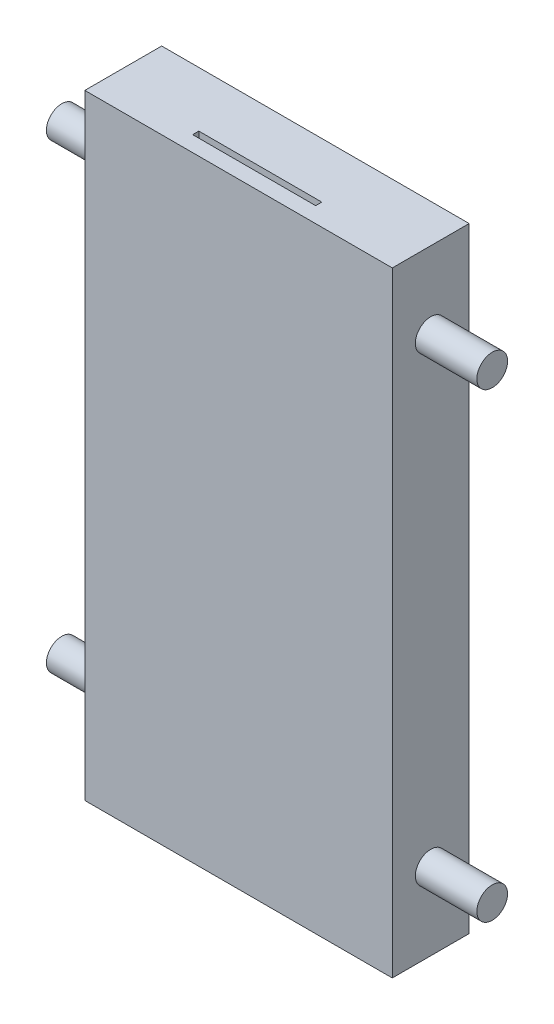
ISO-10303-21;
HEADER;
FILE_DESCRIPTION(('STEP AP214'),'2;1');
FILE_NAME('part.step','',(''),(''),'','','');
FILE_SCHEMA(('AUTOMOTIVE_DESIGN { 1 0 10303 214 1 1 1 1 }'));
ENDSEC;
DATA;
#1=APPLICATION_CONTEXT('core data for automotive mechanical design processes');
#2=APPLICATION_PROTOCOL_DEFINITION('international standard','automotive_design',2000,#1);
#3=PRODUCT_CONTEXT('',#1,'mechanical');
#4=PRODUCT('Part','Part','',(#3));
#5=PRODUCT_RELATED_PRODUCT_CATEGORY('part','',(#4));
#6=PRODUCT_DEFINITION_FORMATION('','',#4);
#7=PRODUCT_DEFINITION_CONTEXT('part definition',#1,'design');
#8=PRODUCT_DEFINITION('design','',#6,#7);
#9=PRODUCT_DEFINITION_SHAPE('','',#8);
#10=(LENGTH_UNIT() NAMED_UNIT(*) SI_UNIT(.MILLI.,.METRE.));
#11=(NAMED_UNIT(*) PLANE_ANGLE_UNIT() SI_UNIT($,.RADIAN.));
#12=(NAMED_UNIT(*) SI_UNIT($,.STERADIAN.) SOLID_ANGLE_UNIT());
#13=UNCERTAINTY_MEASURE_WITH_UNIT(LENGTH_MEASURE(1.E-05),#10,'distance_accuracy_value','');
#14=(GEOMETRIC_REPRESENTATION_CONTEXT(3) GLOBAL_UNCERTAINTY_ASSIGNED_CONTEXT((#13)) GLOBAL_UNIT_ASSIGNED_CONTEXT((#10,
#11,#12)) REPRESENTATION_CONTEXT('',''));
#15=CARTESIAN_POINT('',(0.,0.,0.));
#16=DIRECTION('',(0.,0.,1.));
#17=DIRECTION('',(1.,0.,0.));
#18=AXIS2_PLACEMENT_3D('',#15,#16,#17);
#19=CARTESIAN_POINT('',(12.7,0.,3.175));
#20=DIRECTION('',(0.,1.,0.));
#21=DIRECTION('',(0.,0.,1.));
#22=AXIS2_PLACEMENT_3D('',#19,#20,#21);
#23=PLANE('',#22);
#24=DIRECTION('',(-1.,0.,0.));
#25=VECTOR('',#24,1.);
#26=CARTESIAN_POINT('',(8.89000000000002,0.,2.27655366080337));
#27=LINE('',#26,#25);
#28=CARTESIAN_POINT('',(8.89000000000002,0.,2.27655366080337));
#29=VERTEX_POINT('',#28);
#30=CARTESIAN_POINT('',(3.81000000000002,0.,2.27655366080337));
#31=VERTEX_POINT('',#30);
#32=EDGE_CURVE('E129',#29,#31,#27,.T.);
#33=ORIENTED_EDGE('',*,*,#32,.T.);
#34=DIRECTION('',(0.,0.,1.));
#35=VECTOR('',#34,1.);
#36=CARTESIAN_POINT('',(3.81000000000002,0.,2.53055366080337));
#37=LINE('',#36,#35);
#38=CARTESIAN_POINT('',(3.81000000000002,0.,2.53055366080337));
#39=VERTEX_POINT('',#38);
#40=EDGE_CURVE('E122',#31,#39,#37,.T.);
#41=ORIENTED_EDGE('',*,*,#40,.T.);
#42=DIRECTION('',(1.,0.,0.));
#43=VECTOR('',#42,1.);
#44=CARTESIAN_POINT('',(8.89000000000002,0.,2.53055366080337));
#45=LINE('',#44,#43);
#46=CARTESIAN_POINT('',(8.89000000000002,0.,2.53055366080337));
#47=VERTEX_POINT('',#46);
#48=EDGE_CURVE('E132',#39,#47,#45,.T.);
#49=ORIENTED_EDGE('',*,*,#48,.T.);
#50=DIRECTION('',(0.,0.,-1.));
#51=VECTOR('',#50,1.);
#52=CARTESIAN_POINT('',(8.89000000000002,0.,2.53055366080337));
#53=LINE('',#52,#51);
#54=EDGE_CURVE('E58',#47,#29,#53,.T.);
#55=ORIENTED_EDGE('',*,*,#54,.T.);
#56=EDGE_LOOP('',(#33,#41,#49,#55));
#57=FACE_BOUND('',#56,.T.);
#58=DIRECTION('',(1.,0.,0.));
#59=VECTOR('',#58,1.);
#60=CARTESIAN_POINT('',(12.7,0.,0.));
#61=LINE('',#60,#59);
#62=CARTESIAN_POINT('',(0.,0.,0.));
#63=VERTEX_POINT('',#62);
#64=CARTESIAN_POINT('',(12.7,0.,0.));
#65=VERTEX_POINT('',#64);
#66=EDGE_CURVE('E191',#63,#65,#61,.T.);
#67=ORIENTED_EDGE('',*,*,#66,.T.);
#68=DIRECTION('',(0.,0.,-1.));
#69=VECTOR('',#68,1.);
#70=CARTESIAN_POINT('',(12.7,0.,3.175));
#71=LINE('',#70,#69);
#72=CARTESIAN_POINT('',(12.7,0.,3.175));
#73=VERTEX_POINT('',#72);
#74=EDGE_CURVE('E11',#73,#65,#71,.T.);
#75=ORIENTED_EDGE('',*,*,#74,.F.);
#76=DIRECTION('',(1.,0.,0.));
#77=VECTOR('',#76,1.);
#78=CARTESIAN_POINT('',(12.7,0.,3.175));
#79=LINE('',#78,#77);
#80=CARTESIAN_POINT('',(0.,0.,3.175));
#81=VERTEX_POINT('',#80);
#82=EDGE_CURVE('E192',#81,#73,#79,.T.);
#83=ORIENTED_EDGE('',*,*,#82,.F.);
#84=DIRECTION('',(0.,0.,-1.));
#85=VECTOR('',#84,1.);
#86=CARTESIAN_POINT('',(0.,0.,3.175));
#87=LINE('',#86,#85);
#88=EDGE_CURVE('E206',#81,#63,#87,.T.);
#89=ORIENTED_EDGE('',*,*,#88,.T.);
#90=EDGE_LOOP('',(#67,#75,#83,#89));
#91=FACE_BOUND('',#90,.T.);
#92=ADVANCED_FACE('F38',(#57,#91),#23,.F.);
#93=CARTESIAN_POINT('',(12.7,25.4,3.175));
#94=DIRECTION('',(-1.,0.,0.));
#95=DIRECTION('',(0.,0.,1.));
#96=AXIS2_PLACEMENT_3D('',#93,#94,#95);
#97=PLANE('',#96);
#98=CARTESIAN_POINT('',(12.7,3.175,1.5875));
#99=DIRECTION('',(-1.,0.,0.));
#100=DIRECTION('',(0.,0.,1.));
#101=AXIS2_PLACEMENT_3D('',#98,#99,#100);
#102=CIRCLE('',#101,0.635);
#103=CARTESIAN_POINT('',(12.7,3.175,2.2225));
#104=VERTEX_POINT('',#103);
#105=EDGE_CURVE('E175',#104,#104,#102,.T.);
#106=ORIENTED_EDGE('',*,*,#105,.T.);
#107=EDGE_LOOP('',(#106));
#108=FACE_BOUND('',#107,.T.);
#109=CARTESIAN_POINT('',(12.7,22.225,1.5875));
#110=DIRECTION('',(-1.,0.,0.));
#111=DIRECTION('',(0.,0.,1.));
#112=AXIS2_PLACEMENT_3D('',#109,#110,#111);
#113=CIRCLE('',#112,0.635);
#114=CARTESIAN_POINT('',(12.7,22.225,2.2225));
#115=VERTEX_POINT('',#114);
#116=EDGE_CURVE('E187',#115,#115,#113,.T.);
#117=ORIENTED_EDGE('',*,*,#116,.T.);
#118=EDGE_LOOP('',(#117));
#119=FACE_BOUND('',#118,.T.);
#120=DIRECTION('',(0.,1.,0.));
#121=VECTOR('',#120,1.);
#122=CARTESIAN_POINT('',(12.7,25.4,0.));
#123=LINE('',#122,#121);
#124=CARTESIAN_POINT('',(12.7,25.4,0.));
#125=VERTEX_POINT('',#124);
#126=EDGE_CURVE('E210',#65,#125,#123,.T.);
#127=ORIENTED_EDGE('',*,*,#126,.T.);
#128=DIRECTION('',(0.,0.,-1.));
#129=VECTOR('',#128,1.);
#130=CARTESIAN_POINT('',(12.7,25.4,3.175));
#131=LINE('',#130,#129);
#132=CARTESIAN_POINT('',(12.7,25.4,3.175));
#133=VERTEX_POINT('',#132);
#134=EDGE_CURVE('E47',#133,#125,#131,.T.);
#135=ORIENTED_EDGE('',*,*,#134,.F.);
#136=DIRECTION('',(0.,1.,0.));
#137=VECTOR('',#136,1.);
#138=CARTESIAN_POINT('',(12.7,25.4,3.175));
#139=LINE('',#138,#137);
#140=EDGE_CURVE('E196',#73,#133,#139,.T.);
#141=ORIENTED_EDGE('',*,*,#140,.F.);
#142=ORIENTED_EDGE('',*,*,#74,.T.);
#143=EDGE_LOOP('',(#127,#135,#141,#142));
#144=FACE_BOUND('',#143,.T.);
#145=ADVANCED_FACE('F249',(#108,#119,#144),#97,.F.);
#146=CARTESIAN_POINT('',(0.,25.4,3.175));
#147=DIRECTION('',(0.,-1.,0.));
#148=DIRECTION('',(0.,0.,-1.));
#149=AXIS2_PLACEMENT_3D('',#146,#147,#148);
#150=PLANE('',#149);
#151=DIRECTION('',(1.,0.,0.));
#152=VECTOR('',#151,1.);
#153=CARTESIAN_POINT('',(8.89000000000002,25.4,2.53055366080337));
#154=LINE('',#153,#152);
#155=CARTESIAN_POINT('',(3.81000000000002,25.4,2.53055366080337));
#156=VERTEX_POINT('',#155);
#157=CARTESIAN_POINT('',(8.89000000000002,25.4,2.53055366080337));
#158=VERTEX_POINT('',#157);
#159=EDGE_CURVE('E154',#156,#158,#154,.T.);
#160=ORIENTED_EDGE('',*,*,#159,.F.);
#161=DIRECTION('',(0.,0.,1.));
#162=VECTOR('',#161,1.);
#163=CARTESIAN_POINT('',(3.81000000000002,25.4,2.53055366080337));
#164=LINE('',#163,#162);
#165=CARTESIAN_POINT('',(3.81000000000002,25.4,2.27655366080337));
#166=VERTEX_POINT('',#165);
#167=EDGE_CURVE('E68',#166,#156,#164,.T.);
#168=ORIENTED_EDGE('',*,*,#167,.F.);
#169=DIRECTION('',(-1.,0.,0.));
#170=VECTOR('',#169,1.);
#171=CARTESIAN_POINT('',(8.89000000000002,25.4,2.27655366080337));
#172=LINE('',#171,#170);
#173=CARTESIAN_POINT('',(8.89000000000002,25.4,2.27655366080337));
#174=VERTEX_POINT('',#173);
#175=EDGE_CURVE('E140',#174,#166,#172,.T.);
#176=ORIENTED_EDGE('',*,*,#175,.F.);
#177=DIRECTION('',(0.,0.,-1.));
#178=VECTOR('',#177,1.);
#179=CARTESIAN_POINT('',(8.89000000000002,25.4,2.53055366080337));
#180=LINE('',#179,#178);
#181=EDGE_CURVE('E145',#158,#174,#180,.T.);
#182=ORIENTED_EDGE('',*,*,#181,.F.);
#183=EDGE_LOOP('',(#160,#168,#176,#182));
#184=FACE_BOUND('',#183,.T.);
#185=DIRECTION('',(-1.,0.,0.));
#186=VECTOR('',#185,1.);
#187=CARTESIAN_POINT('',(0.,25.4,0.));
#188=LINE('',#187,#186);
#189=CARTESIAN_POINT('',(0.,25.4,0.));
#190=VERTEX_POINT('',#189);
#191=EDGE_CURVE('E213',#125,#190,#188,.T.);
#192=ORIENTED_EDGE('',*,*,#191,.T.);
#193=DIRECTION('',(0.,0.,-1.));
#194=VECTOR('',#193,1.);
#195=CARTESIAN_POINT('',(0.,25.4,3.175));
#196=LINE('',#195,#194);
#197=CARTESIAN_POINT('',(0.,25.4,3.175));
#198=VERTEX_POINT('',#197);
#199=EDGE_CURVE('E219',#198,#190,#196,.T.);
#200=ORIENTED_EDGE('',*,*,#199,.F.);
#201=DIRECTION('',(-1.,0.,0.));
#202=VECTOR('',#201,1.);
#203=CARTESIAN_POINT('',(0.,25.4,3.175));
#204=LINE('',#203,#202);
#205=EDGE_CURVE('E200',#133,#198,#204,.T.);
#206=ORIENTED_EDGE('',*,*,#205,.F.);
#207=ORIENTED_EDGE('',*,*,#134,.T.);
#208=EDGE_LOOP('',(#192,#200,#206,#207));
#209=FACE_BOUND('',#208,.T.);
#210=ADVANCED_FACE('F253',(#184,#209),#150,.F.);
#211=CARTESIAN_POINT('',(0.,0.,3.175));
#212=DIRECTION('',(1.,0.,0.));
#213=DIRECTION('',(0.,0.,-1.));
#214=AXIS2_PLACEMENT_3D('',#211,#212,#213);
#215=PLANE('',#214);
#216=CARTESIAN_POINT('',(0.,3.175,1.5875));
#217=DIRECTION('',(1.,0.,0.));
#218=DIRECTION('',(0.,0.,-1.));
#219=AXIS2_PLACEMENT_3D('',#216,#217,#218);
#220=CIRCLE('',#219,0.635);
#221=CARTESIAN_POINT('',(0.,3.175,0.9525));
#222=VERTEX_POINT('',#221);
#223=EDGE_CURVE('E41',#222,#222,#220,.T.);
#224=ORIENTED_EDGE('',*,*,#223,.T.);
#225=EDGE_LOOP('',(#224));
#226=FACE_BOUND('',#225,.T.);
#227=CARTESIAN_POINT('',(0.,22.225,1.5875));
#228=DIRECTION('',(1.,0.,0.));
#229=DIRECTION('',(0.,0.,-1.));
#230=AXIS2_PLACEMENT_3D('',#227,#228,#229);
#231=CIRCLE('',#230,0.635);
#232=CARTESIAN_POINT('',(0.,22.225,0.9525));
#233=VERTEX_POINT('',#232);
#234=EDGE_CURVE('E186',#233,#233,#231,.T.);
#235=ORIENTED_EDGE('',*,*,#234,.T.);
#236=EDGE_LOOP('',(#235));
#237=FACE_BOUND('',#236,.T.);
#238=DIRECTION('',(0.,-1.,0.));
#239=VECTOR('',#238,1.);
#240=CARTESIAN_POINT('',(0.,0.,0.));
#241=LINE('',#240,#239);
#242=EDGE_CURVE('E197',#190,#63,#241,.T.);
#243=ORIENTED_EDGE('',*,*,#242,.T.);
#244=ORIENTED_EDGE('',*,*,#88,.F.);
#245=DIRECTION('',(0.,-1.,0.));
#246=VECTOR('',#245,1.);
#247=CARTESIAN_POINT('',(0.,0.,3.175));
#248=LINE('',#247,#246);
#249=EDGE_CURVE('E203',#198,#81,#248,.T.);
#250=ORIENTED_EDGE('',*,*,#249,.F.);
#251=ORIENTED_EDGE('',*,*,#199,.T.);
#252=EDGE_LOOP('',(#243,#244,#250,#251));
#253=FACE_BOUND('',#252,.T.);
#254=ADVANCED_FACE('F229',(#226,#237,#253),#215,.F.);
#255=CARTESIAN_POINT('',(0.,0.,3.175));
#256=DIRECTION('',(0.,0.,-1.));
#257=DIRECTION('',(-1.,0.,0.));
#258=AXIS2_PLACEMENT_3D('',#255,#256,#257);
#259=PLANE('',#258);
#260=ORIENTED_EDGE('',*,*,#82,.T.);
#261=ORIENTED_EDGE('',*,*,#140,.T.);
#262=ORIENTED_EDGE('',*,*,#205,.T.);
#263=ORIENTED_EDGE('',*,*,#249,.T.);
#264=EDGE_LOOP('',(#260,#261,#262,#263));
#265=FACE_BOUND('',#264,.T.);
#266=ADVANCED_FACE('F264',(#265),#259,.F.);
#267=CARTESIAN_POINT('',(0.,0.,0.));
#268=DIRECTION('',(0.,0.,-1.));
#269=DIRECTION('',(-1.,0.,0.));
#270=AXIS2_PLACEMENT_3D('',#267,#268,#269);
#271=PLANE('',#270);
#272=ORIENTED_EDGE('',*,*,#66,.F.);
#273=ORIENTED_EDGE('',*,*,#242,.F.);
#274=ORIENTED_EDGE('',*,*,#191,.F.);
#275=ORIENTED_EDGE('',*,*,#126,.F.);
#276=EDGE_LOOP('',(#272,#273,#274,#275));
#277=FACE_BOUND('',#276,.T.);
#278=ADVANCED_FACE('F244',(#277),#271,.T.);
#279=CARTESIAN_POINT('',(-2.54,0.,0.));
#280=DIRECTION('',(1.,0.,0.));
#281=DIRECTION('',(0.,0.,-1.));
#282=AXIS2_PLACEMENT_3D('',#279,#280,#281);
#283=PLANE('',#282);
#284=CARTESIAN_POINT('',(-2.54,22.225,1.5875));
#285=DIRECTION('',(1.,0.,0.));
#286=DIRECTION('',(0.,0.,-1.));
#287=AXIS2_PLACEMENT_3D('',#284,#285,#286);
#288=CIRCLE('',#287,0.635);
#289=CARTESIAN_POINT('',(-2.54,22.225,0.9525));
#290=VERTEX_POINT('',#289);
#291=EDGE_CURVE('E182',#290,#290,#288,.T.);
#292=ORIENTED_EDGE('',*,*,#291,.F.);
#293=EDGE_LOOP('',(#292));
#294=FACE_BOUND('',#293,.T.);
#295=ADVANCED_FACE('F235',(#294),#283,.F.);
#296=CARTESIAN_POINT('',(-2.54,22.225,1.5875));
#297=DIRECTION('',(1.,0.,0.));
#298=DIRECTION('',(0.,0.,-1.));
#299=AXIS2_PLACEMENT_3D('',#296,#297,#298);
#300=CYLINDRICAL_SURFACE('',#299,0.635);
#301=ORIENTED_EDGE('',*,*,#291,.T.);
#302=EDGE_LOOP('',(#301));
#303=FACE_BOUND('',#302,.T.);
#304=ORIENTED_EDGE('',*,*,#234,.F.);
#305=EDGE_LOOP('',(#304));
#306=FACE_BOUND('',#305,.T.);
#307=ADVANCED_FACE('F232',(#303,#306),#300,.T.);
#308=CARTESIAN_POINT('',(15.24,22.225,1.5875));
#309=DIRECTION('',(1.,0.,0.));
#310=DIRECTION('',(0.,0.,-1.));
#311=AXIS2_PLACEMENT_3D('',#308,#309,#310);
#312=CIRCLE('',#311,0.635);
#313=CARTESIAN_POINT('',(15.24,22.225,0.9525));
#314=VERTEX_POINT('',#313);
#315=EDGE_CURVE('E179',#314,#314,#312,.T.);
#316=ORIENTED_EDGE('',*,*,#315,.F.);
#317=EDGE_LOOP('',(#316));
#318=FACE_BOUND('',#317,.T.);
#319=ORIENTED_EDGE('',*,*,#116,.F.);
#320=EDGE_LOOP('',(#319));
#321=FACE_BOUND('',#320,.T.);
#322=ADVANCED_FACE('F234',(#318,#321),#300,.T.);
#323=CARTESIAN_POINT('',(15.24,0.,0.));
#324=DIRECTION('',(1.,0.,0.));
#325=DIRECTION('',(0.,0.,-1.));
#326=AXIS2_PLACEMENT_3D('',#323,#324,#325);
#327=PLANE('',#326);
#328=ORIENTED_EDGE('',*,*,#315,.T.);
#329=EDGE_LOOP('',(#328));
#330=FACE_BOUND('',#329,.T.);
#331=ADVANCED_FACE('F242',(#330),#327,.T.);
#332=CARTESIAN_POINT('',(-2.54,3.175,1.5875));
#333=DIRECTION('',(1.,0.,0.));
#334=DIRECTION('',(0.,0.,-1.));
#335=AXIS2_PLACEMENT_3D('',#332,#333,#334);
#336=PLANE('',#335);
#337=CARTESIAN_POINT('',(-2.54,3.175,1.5875));
#338=DIRECTION('',(1.,0.,0.));
#339=DIRECTION('',(0.,0.,-1.));
#340=AXIS2_PLACEMENT_3D('',#337,#338,#339);
#341=CIRCLE('',#340,0.635);
#342=CARTESIAN_POINT('',(-2.54,3.175,0.9525));
#343=VERTEX_POINT('',#342);
#344=EDGE_CURVE('E171',#343,#343,#341,.T.);
#345=ORIENTED_EDGE('',*,*,#344,.F.);
#346=EDGE_LOOP('',(#345));
#347=FACE_BOUND('',#346,.T.);
#348=ADVANCED_FACE('F312',(#347),#336,.F.);
#349=CARTESIAN_POINT('',(-2.54,3.175,1.5875));
#350=DIRECTION('',(1.,0.,0.));
#351=DIRECTION('',(0.,0.,-1.));
#352=AXIS2_PLACEMENT_3D('',#349,#350,#351);
#353=CYLINDRICAL_SURFACE('',#352,0.635);
#354=ORIENTED_EDGE('',*,*,#344,.T.);
#355=EDGE_LOOP('',(#354));
#356=FACE_BOUND('',#355,.T.);
#357=ORIENTED_EDGE('',*,*,#223,.F.);
#358=EDGE_LOOP('',(#357));
#359=FACE_BOUND('',#358,.T.);
#360=ADVANCED_FACE('F333',(#356,#359),#353,.T.);
#361=CARTESIAN_POINT('',(15.24,3.175,1.5875));
#362=DIRECTION('',(1.,0.,0.));
#363=DIRECTION('',(0.,0.,-1.));
#364=AXIS2_PLACEMENT_3D('',#361,#362,#363);
#365=CIRCLE('',#364,0.635);
#366=CARTESIAN_POINT('',(15.24,3.175,0.9525));
#367=VERTEX_POINT('',#366);
#368=EDGE_CURVE('E163',#367,#367,#365,.T.);
#369=ORIENTED_EDGE('',*,*,#368,.F.);
#370=EDGE_LOOP('',(#369));
#371=FACE_BOUND('',#370,.T.);
#372=ORIENTED_EDGE('',*,*,#105,.F.);
#373=EDGE_LOOP('',(#372));
#374=FACE_BOUND('',#373,.T.);
#375=ADVANCED_FACE('F343',(#371,#374),#353,.T.);
#376=CARTESIAN_POINT('',(15.24,3.175,1.5875));
#377=DIRECTION('',(1.,0.,0.));
#378=DIRECTION('',(0.,0.,-1.));
#379=AXIS2_PLACEMENT_3D('',#376,#377,#378);
#380=PLANE('',#379);
#381=ORIENTED_EDGE('',*,*,#368,.T.);
#382=EDGE_LOOP('',(#381));
#383=FACE_BOUND('',#382,.T.);
#384=ADVANCED_FACE('F353',(#383),#380,.T.);
#385=CARTESIAN_POINT('',(3.81000000000002,0.,2.53055366080337));
#386=DIRECTION('',(-1.,0.,0.));
#387=DIRECTION('',(0.,0.,1.));
#388=AXIS2_PLACEMENT_3D('',#385,#386,#387);
#389=PLANE('',#388);
#390=ORIENTED_EDGE('',*,*,#167,.T.);
#391=DIRECTION('',(0.,1.,0.));
#392=VECTOR('',#391,1.);
#393=CARTESIAN_POINT('',(3.81000000000002,0.,2.53055366080337));
#394=LINE('',#393,#392);
#395=EDGE_CURVE('E118',#39,#156,#394,.T.);
#396=ORIENTED_EDGE('',*,*,#395,.F.);
#397=ORIENTED_EDGE('',*,*,#40,.F.);
#398=DIRECTION('',(0.,1.,0.));
#399=VECTOR('',#398,1.);
#400=CARTESIAN_POINT('',(3.81000000000002,0.,2.27655366080337));
#401=LINE('',#400,#399);
#402=EDGE_CURVE('E160',#31,#166,#401,.T.);
#403=ORIENTED_EDGE('',*,*,#402,.T.);
#404=EDGE_LOOP('',(#390,#396,#397,#403));
#405=FACE_BOUND('',#404,.T.);
#406=ADVANCED_FACE('F120',(#405),#389,.F.);
#407=CARTESIAN_POINT('',(8.89000000000002,0.,2.27655366080337));
#408=DIRECTION('',(0.,0.,-1.));
#409=DIRECTION('',(-1.,0.,0.));
#410=AXIS2_PLACEMENT_3D('',#407,#408,#409);
#411=PLANE('',#410);
#412=ORIENTED_EDGE('',*,*,#175,.T.);
#413=ORIENTED_EDGE('',*,*,#402,.F.);
#414=ORIENTED_EDGE('',*,*,#32,.F.);
#415=DIRECTION('',(0.,1.,0.));
#416=VECTOR('',#415,1.);
#417=CARTESIAN_POINT('',(8.89000000000002,0.,2.27655366080337));
#418=LINE('',#417,#416);
#419=EDGE_CURVE('E164',#29,#174,#418,.T.);
#420=ORIENTED_EDGE('',*,*,#419,.T.);
#421=EDGE_LOOP('',(#412,#413,#414,#420));
#422=FACE_BOUND('',#421,.T.);
#423=ADVANCED_FACE('F379',(#422),#411,.F.);
#424=CARTESIAN_POINT('',(8.89000000000002,0.,2.53055366080337));
#425=DIRECTION('',(1.,0.,0.));
#426=DIRECTION('',(0.,0.,-1.));
#427=AXIS2_PLACEMENT_3D('',#424,#425,#426);
#428=PLANE('',#427);
#429=ORIENTED_EDGE('',*,*,#181,.T.);
#430=ORIENTED_EDGE('',*,*,#419,.F.);
#431=ORIENTED_EDGE('',*,*,#54,.F.);
#432=DIRECTION('',(0.,1.,0.));
#433=VECTOR('',#432,1.);
#434=CARTESIAN_POINT('',(8.89000000000002,0.,2.53055366080337));
#435=LINE('',#434,#433);
#436=EDGE_CURVE('E128',#47,#158,#435,.T.);
#437=ORIENTED_EDGE('',*,*,#436,.T.);
#438=EDGE_LOOP('',(#429,#430,#431,#437));
#439=FACE_BOUND('',#438,.T.);
#440=ADVANCED_FACE('F388',(#439),#428,.F.);
#441=CARTESIAN_POINT('',(8.89000000000002,0.,2.53055366080337));
#442=DIRECTION('',(0.,0.,1.));
#443=DIRECTION('',(1.,0.,0.));
#444=AXIS2_PLACEMENT_3D('',#441,#442,#443);
#445=PLANE('',#444);
#446=ORIENTED_EDGE('',*,*,#159,.T.);
#447=ORIENTED_EDGE('',*,*,#436,.F.);
#448=ORIENTED_EDGE('',*,*,#48,.F.);
#449=ORIENTED_EDGE('',*,*,#395,.T.);
#450=EDGE_LOOP('',(#446,#447,#448,#449));
#451=FACE_BOUND('',#450,.T.);
#452=ADVANCED_FACE('F133',(#451),#445,.F.);
#453=CLOSED_SHELL('',(#92,#145,#210,#254,#266,#278,#295,#307,#322,#331,#348,#360,#375,#384,#406,
#423,#440,#452));
#454=MANIFOLD_SOLID_BREP('B2',#453);
#455=ADVANCED_BREP_SHAPE_REPRESENTATION('',(#18,#454),#14);
#456=SHAPE_DEFINITION_REPRESENTATION(#9,#455);
ENDSEC;
END-ISO-10303-21;
